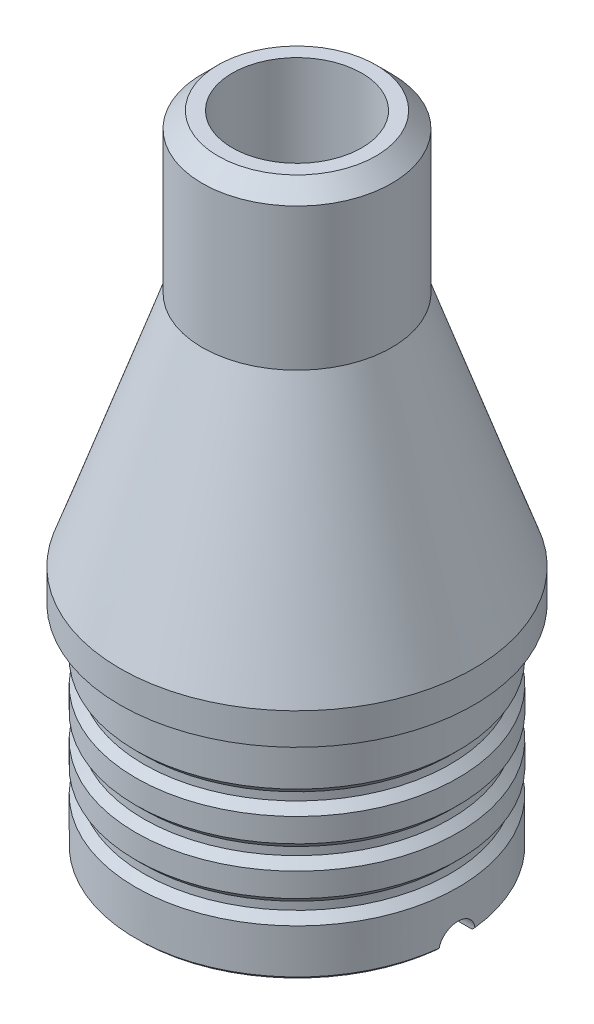
ISO-10303-21;
HEADER;
FILE_DESCRIPTION(('STEP AP214'),'2;1');
FILE_NAME('part.step','',(''),(''),'','','');
FILE_SCHEMA(('AUTOMOTIVE_DESIGN { 1 0 10303 214 1 1 1 1 }'));
ENDSEC;
DATA;
#1=APPLICATION_CONTEXT('core data for automotive mechanical design processes');
#2=APPLICATION_PROTOCOL_DEFINITION('international standard','automotive_design',2000,#1);
#3=PRODUCT_CONTEXT('',#1,'mechanical');
#4=PRODUCT('Part','Part','',(#3));
#5=PRODUCT_RELATED_PRODUCT_CATEGORY('part','',(#4));
#6=PRODUCT_DEFINITION_FORMATION('','',#4);
#7=PRODUCT_DEFINITION_CONTEXT('part definition',#1,'design');
#8=PRODUCT_DEFINITION('design','',#6,#7);
#9=PRODUCT_DEFINITION_SHAPE('','',#8);
#10=(LENGTH_UNIT() NAMED_UNIT(*) SI_UNIT(.MILLI.,.METRE.));
#11=(NAMED_UNIT(*) PLANE_ANGLE_UNIT() SI_UNIT($,.RADIAN.));
#12=(NAMED_UNIT(*) SI_UNIT($,.STERADIAN.) SOLID_ANGLE_UNIT());
#13=UNCERTAINTY_MEASURE_WITH_UNIT(LENGTH_MEASURE(1.E-05),#10,'distance_accuracy_value','');
#14=(GEOMETRIC_REPRESENTATION_CONTEXT(3) GLOBAL_UNCERTAINTY_ASSIGNED_CONTEXT((#13)) GLOBAL_UNIT_ASSIGNED_CONTEXT((#10,
#11,#12)) REPRESENTATION_CONTEXT('',''));
#15=CARTESIAN_POINT('',(0.,0.,0.));
#16=DIRECTION('',(0.,0.,1.));
#17=DIRECTION('',(1.,0.,0.));
#18=AXIS2_PLACEMENT_3D('',#15,#16,#17);
#19=CARTESIAN_POINT('',(0.,0.,0.));
#20=DIRECTION('',(0.,-1.,0.));
#21=DIRECTION('',(0.,0.,-1.));
#22=AXIS2_PLACEMENT_3D('',#19,#20,#21);
#23=CYLINDRICAL_SURFACE('',#22,10.2);
#24=CARTESIAN_POINT('',(-10.1349642327933,-5.5,1.15));
#25=CARTESIAN_POINT('',(-10.1349633502191,-5.46775524002687,1.14999990768807));
#26=CARTESIAN_POINT('',(-10.1351183107459,-5.43552602867082,1.14864298397679));
#27=CARTESIAN_POINT('',(-10.1357306130334,-5.37130024515533,1.14323046614495));
#28=CARTESIAN_POINT('',(-10.1361879331642,-5.33930365652024,1.13917506506559));
#29=CARTESIAN_POINT('',(-10.1379972709886,-5.24407609154166,1.12300336615497));
#30=CARTESIAN_POINT('',(-10.139786733819,-5.181486197438,1.10688144330646));
#31=CARTESIAN_POINT('',(-10.1443316050847,-5.05992511597337,1.06441844600939));
#32=CARTESIAN_POINT('',(-10.1470873542538,-5.00095521373134,1.0380737664428));
#33=CARTESIAN_POINT('',(-10.1532530389607,-4.88827027792611,0.975922259404736));
#34=CARTESIAN_POINT('',(-10.1566629090721,-4.83455471962326,0.940116378127089));
#35=CARTESIAN_POINT('',(-10.1637697244164,-4.73366928584066,0.859888503557032));
#36=CARTESIAN_POINT('',(-10.167467760398,-4.68652637217174,0.815432714696834));
#37=CARTESIAN_POINT('',(-10.1747248228774,-4.60034809349203,0.719233667168273));
#38=CARTESIAN_POINT('',(-10.1782838281338,-4.56131396346037,0.667489300450102));
#39=CARTESIAN_POINT('',(-10.1848725605143,-4.49237204834464,0.558015447795672));
#40=CARTESIAN_POINT('',(-10.1879008568018,-4.46248877763677,0.500270430744985));
#41=CARTESIAN_POINT('',(-10.1930746684833,-4.41285516540403,0.380545463588456));
#42=CARTESIAN_POINT('',(-10.1952202634919,-4.39310390998948,0.318565896003171));
#43=CARTESIAN_POINT('',(-10.1983793733878,-4.36437381898072,0.192407625739225));
#44=CARTESIAN_POINT('',(-10.1993976627615,-4.35534953926305,0.128239393542608));
#45=CARTESIAN_POINT('',(-10.2002037114243,-4.34818878553913,-0.000709889697529851));
#46=CARTESIAN_POINT('',(-10.1999914806608,-4.35005222351699,-0.0654909357828598));
#47=CARTESIAN_POINT('',(-10.1983642420948,-4.36457773958874,-0.193514620927063));
#48=CARTESIAN_POINT('',(-10.1969547119456,-4.37719063968913,-0.256762919099871));
#49=CARTESIAN_POINT('',(-10.1930974865104,-4.41278025297118,-0.380238921333598));
#50=CARTESIAN_POINT('',(-10.1906497800774,-4.43575707743215,-0.440466592953792));
#51=CARTESIAN_POINT('',(-10.1849818180886,-4.49147592850967,-0.5563468347658));
#52=CARTESIAN_POINT('',(-10.1817598472327,-4.52423967673852,-0.611988873160002));
#53=CARTESIAN_POINT('',(-10.1749045803068,-4.59858515491832,-0.71700073829481));
#54=CARTESIAN_POINT('',(-10.1712712867612,-4.64016683075151,-0.766370603526284));
#55=CARTESIAN_POINT('',(-10.1639770473594,-4.73123720275205,-0.857721543596263));
#56=CARTESIAN_POINT('',(-10.1603160585213,-4.7807676350635,-0.899661012877121));
#57=CARTESIAN_POINT('',(-10.1533975045894,-4.88620621344587,-0.974649868241155));
#58=CARTESIAN_POINT('',(-10.1501400609706,-4.94211627022756,-1.00769658092046));
#59=CARTESIAN_POINT('',(-10.144396900118,-5.05876888795778,-1.06396206412594));
#60=CARTESIAN_POINT('',(-10.1419118758195,-5.11951572696583,-1.08717201686574));
#61=CARTESIAN_POINT('',(-10.1380059945217,-5.2440341028807,-1.12301603244045));
#62=CARTESIAN_POINT('',(-10.1365835317193,-5.30780092008825,-1.13566605745126));
#63=CARTESIAN_POINT('',(-10.1355027722522,-5.39335012537774,-1.1452448578247));
#64=CARTESIAN_POINT('',(-10.1353009552745,-5.41465947201716,-1.14702890276953));
#65=CARTESIAN_POINT('',(-10.1350318472777,-5.45730956145658,-1.14940487104262));
#66=CARTESIAN_POINT('',(-10.1349643312788,-5.47865019171676,-1.14999878807522));
#67=CARTESIAN_POINT('',(-10.1349642327933,-5.5,-1.15));
#68=B_SPLINE_CURVE_WITH_KNOTS('',3,(#24,#25,#26,#27,#28,#29,#30,#31,#32,#33,#34,#35,#36,#37,#38,
#39,#40,#41,#42,#43,#44,#45,#46,#47,#48,#49,#50,#51,#52,#53,#54,#55,#56,#57,#58,#59,#60,#61,#62,
#63,#64,#65,#66,#67),.UNSPECIFIED.,.F.,.F.,(4,2,2,2,2,2,2,2,2,2,2,2,2,2,2,2,2,2,2,2,2,4),(0.,
0.0966745406116703,0.193342166152487,0.386318709058918,0.579363368270143,0.772388728814853,
0.966183966600919,1.16000869806968,1.35434821648226,1.54867020273374,1.74216598893861,
1.93566021093312,2.12827393397575,2.32088972519578,2.51393623517561,2.70698156041668,
2.90107582233508,3.09522836923152,3.2895545904991,3.4835865374904,3.54771677708946,
3.61173949548653),.UNSPECIFIED.);
#69=CARTESIAN_POINT('',(-10.1369374073238,-5.30000000000002,1.13247516529062));
#70=VERTEX_POINT('',#69);
#71=CARTESIAN_POINT('',(-10.1369374073238,-5.30000000000001,-1.13247516529065));
#72=VERTEX_POINT('',#71);
#73=EDGE_CURVE('E192',#70,#72,#68,.T.);
#74=ORIENTED_EDGE('',*,*,#73,.F.);
#75=CARTESIAN_POINT('',(0.,-5.30000000000002,0.));
#76=DIRECTION('',(0.,-1.,0.));
#77=DIRECTION('',(0.,0.,-1.));
#78=AXIS2_PLACEMENT_3D('',#75,#76,#77);
#79=CIRCLE('',#78,10.2);
#80=CARTESIAN_POINT('',(10.1369374073238,-5.30000000000001,1.13247516529065));
#81=VERTEX_POINT('',#80);
#82=EDGE_CURVE('E58',#70,#81,#79,.F.);
#83=ORIENTED_EDGE('',*,*,#82,.T.);
#84=CARTESIAN_POINT('',(10.1349642327933,-5.5,-1.15));
#85=CARTESIAN_POINT('',(10.1349633502191,-5.46775524002687,-1.14999990768807));
#86=CARTESIAN_POINT('',(10.1351183107459,-5.43552602867082,-1.14864298397679));
#87=CARTESIAN_POINT('',(10.1357306130334,-5.37130024515533,-1.14323046614495));
#88=CARTESIAN_POINT('',(10.1361879331642,-5.33930365652024,-1.13917506506559));
#89=CARTESIAN_POINT('',(10.1379972709886,-5.24407609154166,-1.12300336615497));
#90=CARTESIAN_POINT('',(10.139786733819,-5.181486197438,-1.10688144330646));
#91=CARTESIAN_POINT('',(10.1443316050847,-5.05992511597337,-1.06441844600939));
#92=CARTESIAN_POINT('',(10.1470873542538,-5.00095521373134,-1.0380737664428));
#93=CARTESIAN_POINT('',(10.1532530389607,-4.88827027792611,-0.975922259404736));
#94=CARTESIAN_POINT('',(10.1566629090721,-4.83455471962326,-0.940116378127089));
#95=CARTESIAN_POINT('',(10.1637697244164,-4.73366928584066,-0.859888503557032));
#96=CARTESIAN_POINT('',(10.167467760398,-4.68652637217174,-0.815432714696834));
#97=CARTESIAN_POINT('',(10.1747248228774,-4.60034809349203,-0.719233667168273));
#98=CARTESIAN_POINT('',(10.1782838281338,-4.56131396346037,-0.667489300450102));
#99=CARTESIAN_POINT('',(10.1848725605143,-4.49237204834464,-0.558015447795672));
#100=CARTESIAN_POINT('',(10.1879008568018,-4.46248877763677,-0.500270430744985));
#101=CARTESIAN_POINT('',(10.1930746684833,-4.41285516540403,-0.380545463588456));
#102=CARTESIAN_POINT('',(10.1952202634919,-4.39310390998948,-0.318565896003171));
#103=CARTESIAN_POINT('',(10.1983793733878,-4.36437381898072,-0.192407625739225));
#104=CARTESIAN_POINT('',(10.1993976627615,-4.35534953926305,-0.128239393542608));
#105=CARTESIAN_POINT('',(10.2002037114243,-4.34818878553913,0.000709889697529851));
#106=CARTESIAN_POINT('',(10.1999914806608,-4.35005222351699,0.0654909357828598));
#107=CARTESIAN_POINT('',(10.1983642420948,-4.36457773958874,0.193514620927063));
#108=CARTESIAN_POINT('',(10.1969547119456,-4.37719063968913,0.256762919099871));
#109=CARTESIAN_POINT('',(10.1930974865104,-4.41278025297118,0.380238921333598));
#110=CARTESIAN_POINT('',(10.1906497800774,-4.43575707743215,0.440466592953792));
#111=CARTESIAN_POINT('',(10.1849818180886,-4.49147592850967,0.5563468347658));
#112=CARTESIAN_POINT('',(10.1817598472327,-4.52423967673852,0.611988873160002));
#113=CARTESIAN_POINT('',(10.1749045803068,-4.59858515491832,0.71700073829481));
#114=CARTESIAN_POINT('',(10.1712712867612,-4.64016683075151,0.766370603526284));
#115=CARTESIAN_POINT('',(10.1639770473594,-4.73123720275205,0.857721543596263));
#116=CARTESIAN_POINT('',(10.1603160585213,-4.7807676350635,0.899661012877121));
#117=CARTESIAN_POINT('',(10.1533975045894,-4.88620621344587,0.974649868241155));
#118=CARTESIAN_POINT('',(10.1501400609706,-4.94211627022756,1.00769658092046));
#119=CARTESIAN_POINT('',(10.144396900118,-5.05876888795778,1.06396206412594));
#120=CARTESIAN_POINT('',(10.1419118758195,-5.11951572696583,1.08717201686574));
#121=CARTESIAN_POINT('',(10.1380059945217,-5.2440341028807,1.12301603244045));
#122=CARTESIAN_POINT('',(10.1365835317193,-5.30780092008825,1.13566605745126));
#123=CARTESIAN_POINT('',(10.1355027722522,-5.39335012537774,1.1452448578247));
#124=CARTESIAN_POINT('',(10.1353009552745,-5.41465947201716,1.14702890276953));
#125=CARTESIAN_POINT('',(10.1350318472777,-5.45730956145658,1.14940487104262));
#126=CARTESIAN_POINT('',(10.1349643312788,-5.47865019171676,1.14999878807522));
#127=CARTESIAN_POINT('',(10.1349642327933,-5.5,1.15));
#128=B_SPLINE_CURVE_WITH_KNOTS('',3,(#84,#85,#86,#87,#88,#89,#90,#91,#92,#93,#94,#95,#96,#97,
#98,#99,#100,#101,#102,#103,#104,#105,#106,#107,#108,#109,#110,#111,#112,#113,#114,#115,#116,
#117,#118,#119,#120,#121,#122,#123,#124,#125,#126,#127),.UNSPECIFIED.,.F.,.F.,(4,2,2,2,2,2,2,2,
2,2,2,2,2,2,2,2,2,2,2,2,2,4),(0.,0.0966745406116703,0.193342166152487,0.386318709058918,
0.579363368270143,0.772388728814853,0.966183966600919,1.16000869806968,1.35434821648226,
1.54867020273374,1.74216598893861,1.93566021093312,2.12827393397575,2.32088972519578,
2.51393623517561,2.70698156041668,2.90107582233508,3.09522836923152,3.2895545904991,
3.4835865374904,3.54771677708946,3.61173949548653),.UNSPECIFIED.);
#129=CARTESIAN_POINT('',(10.1369374073238,-5.30000000000002,-1.13247516529062));
#130=VERTEX_POINT('',#129);
#131=EDGE_CURVE('E124',#130,#81,#128,.T.);
#132=ORIENTED_EDGE('',*,*,#131,.F.);
#133=CARTESIAN_POINT('',(0.,-5.30000000000002,0.));
#134=DIRECTION('',(0.,-1.,0.));
#135=DIRECTION('',(0.,0.,-1.));
#136=AXIS2_PLACEMENT_3D('',#133,#134,#135);
#137=CIRCLE('',#136,10.2);
#138=EDGE_CURVE('E296',#130,#72,#137,.F.);
#139=ORIENTED_EDGE('',*,*,#138,.T.);
#140=EDGE_LOOP('',(#74,#83,#132,#139));
#141=FACE_BOUND('',#140,.T.);
#142=CARTESIAN_POINT('',(0.,-2.49999999999997,0.));
#143=DIRECTION('',(0.,1.,0.));
#144=DIRECTION('',(0.,0.,1.));
#145=AXIS2_PLACEMENT_3D('',#142,#143,#144);
#146=CIRCLE('',#145,10.2000000000001);
#147=CARTESIAN_POINT('',(0.,-2.49999999999997,10.2000000000001));
#148=VERTEX_POINT('',#147);
#149=EDGE_CURVE('E323',#148,#148,#146,.T.);
#150=ORIENTED_EDGE('',*,*,#149,.F.);
#151=EDGE_LOOP('',(#150));
#152=FACE_BOUND('',#151,.T.);
#153=ADVANCED_FACE('F35',(#141,#152),#23,.T.);
#154=CARTESIAN_POINT('',(0.,0.500000000000028,0.));
#155=DIRECTION('',(0.,1.,0.));
#156=DIRECTION('',(0.,0.,1.));
#157=AXIS2_PLACEMENT_3D('',#154,#155,#156);
#158=CIRCLE('',#157,10.2);
#159=CARTESIAN_POINT('',(0.,0.500000000000028,10.2));
#160=VERTEX_POINT('',#159);
#161=EDGE_CURVE('E311',#160,#160,#158,.T.);
#162=ORIENTED_EDGE('',*,*,#161,.F.);
#163=EDGE_LOOP('',(#162));
#164=FACE_BOUND('',#163,.T.);
#165=CARTESIAN_POINT('',(0.,-0.999999999999973,0.));
#166=DIRECTION('',(0.,1.,0.));
#167=DIRECTION('',(0.,0.,1.));
#168=AXIS2_PLACEMENT_3D('',#165,#166,#167);
#169=CIRCLE('',#168,10.2000000000001);
#170=CARTESIAN_POINT('',(0.,-0.999999999999973,10.2000000000001));
#171=VERTEX_POINT('',#170);
#172=EDGE_CURVE('E332',#171,#171,#169,.T.);
#173=ORIENTED_EDGE('',*,*,#172,.T.);
#174=EDGE_LOOP('',(#173));
#175=FACE_BOUND('',#174,.T.);
#176=ADVANCED_FACE('F264',(#164,#175),#23,.T.);
#177=CARTESIAN_POINT('',(0.,3.50000000000003,0.));
#178=DIRECTION('',(0.,1.,0.));
#179=DIRECTION('',(0.,0.,1.));
#180=AXIS2_PLACEMENT_3D('',#177,#178,#179);
#181=CIRCLE('',#180,10.2);
#182=CARTESIAN_POINT('',(0.,3.50000000000003,10.2));
#183=VERTEX_POINT('',#182);
#184=EDGE_CURVE('E112',#183,#183,#181,.T.);
#185=ORIENTED_EDGE('',*,*,#184,.F.);
#186=EDGE_LOOP('',(#185));
#187=FACE_BOUND('',#186,.T.);
#188=CARTESIAN_POINT('',(0.,2.00000000000003,0.));
#189=DIRECTION('',(0.,1.,0.));
#190=DIRECTION('',(0.,0.,1.));
#191=AXIS2_PLACEMENT_3D('',#188,#189,#190);
#192=CIRCLE('',#191,10.2);
#193=CARTESIAN_POINT('',(0.,2.00000000000003,10.2));
#194=VERTEX_POINT('',#193);
#195=EDGE_CURVE('E320',#194,#194,#192,.T.);
#196=ORIENTED_EDGE('',*,*,#195,.T.);
#197=EDGE_LOOP('',(#196));
#198=FACE_BOUND('',#197,.T.);
#199=ADVANCED_FACE('F290',(#187,#198),#23,.T.);
#200=CARTESIAN_POINT('',(0.,8.00000000000003,0.));
#201=DIRECTION('',(0.,-1.,0.));
#202=DIRECTION('',(0.,0.,-1.));
#203=AXIS2_PLACEMENT_3D('',#200,#201,#202);
#204=CIRCLE('',#203,10.2);
#205=CARTESIAN_POINT('',(0.,8.00000000000003,-10.2));
#206=VERTEX_POINT('',#205);
#207=EDGE_CURVE('E139',#206,#206,#204,.T.);
#208=ORIENTED_EDGE('',*,*,#207,.T.);
#209=EDGE_LOOP('',(#208));
#210=FACE_BOUND('',#209,.T.);
#211=CARTESIAN_POINT('',(0.,5.00000000000002,0.));
#212=DIRECTION('',(0.,1.,0.));
#213=DIRECTION('',(0.,0.,1.));
#214=AXIS2_PLACEMENT_3D('',#211,#212,#213);
#215=CIRCLE('',#214,10.2);
#216=CARTESIAN_POINT('',(0.,5.00000000000002,10.2));
#217=VERTEX_POINT('',#216);
#218=EDGE_CURVE('E308',#217,#217,#215,.T.);
#219=ORIENTED_EDGE('',*,*,#218,.T.);
#220=EDGE_LOOP('',(#219));
#221=FACE_BOUND('',#220,.T.);
#222=ADVANCED_FACE('F265',(#210,#221),#23,.T.);
#223=CARTESIAN_POINT('',(0.,-5.5,0.));
#224=DIRECTION('',(0.,-1.,0.));
#225=DIRECTION('',(0.,0.,-1.));
#226=AXIS2_PLACEMENT_3D('',#223,#224,#225);
#227=PLANE('',#226);
#228=DIRECTION('',(1.,0.,0.));
#229=VECTOR('',#228,1.);
#230=CARTESIAN_POINT('',(-11.2,-5.5,-1.15));
#231=LINE('',#230,#229);
#232=CARTESIAN_POINT('',(-9.93365491649475,-5.5,-1.15));
#233=VERTEX_POINT('',#232);
#234=CARTESIAN_POINT('',(-8.27042925125413,-5.5,-1.15));
#235=VERTEX_POINT('',#234);
#236=EDGE_CURVE('E96',#233,#235,#231,.T.);
#237=ORIENTED_EDGE('',*,*,#236,.F.);
#238=CARTESIAN_POINT('',(0.,-5.5,0.));
#239=DIRECTION('',(0.,-1.,0.));
#240=DIRECTION('',(0.,0.,-1.));
#241=AXIS2_PLACEMENT_3D('',#238,#239,#240);
#242=CIRCLE('',#241,10.);
#243=CARTESIAN_POINT('',(9.93365491649475,-5.5,-1.15));
#244=VERTEX_POINT('',#243);
#245=EDGE_CURVE('E11',#233,#244,#242,.T.);
#246=ORIENTED_EDGE('',*,*,#245,.T.);
#247=CARTESIAN_POINT('',(8.27042925125413,-5.5,-1.15));
#248=VERTEX_POINT('',#247);
#249=EDGE_CURVE('E294',#248,#244,#231,.T.);
#250=ORIENTED_EDGE('',*,*,#249,.F.);
#251=CARTESIAN_POINT('',(0.,-5.5,0.));
#252=DIRECTION('',(0.,-1.,0.));
#253=DIRECTION('',(0.,0.,-1.));
#254=AXIS2_PLACEMENT_3D('',#251,#252,#253);
#255=CIRCLE('',#254,8.35);
#256=EDGE_CURVE('E119',#235,#248,#255,.T.);
#257=ORIENTED_EDGE('',*,*,#256,.F.);
#258=EDGE_LOOP('',(#237,#246,#250,#257));
#259=FACE_BOUND('',#258,.T.);
#260=ADVANCED_FACE('F238',(#259),#227,.T.);
#261=CARTESIAN_POINT('',(0.,0.,-10.2));
#262=DIRECTION('',(0.,-1.,0.));
#263=DIRECTION('',(0.,0.,-1.));
#264=AXIS2_PLACEMENT_3D('',#261,#262,#263);
#265=PLANE('',#264);
#266=CARTESIAN_POINT('',(0.,0.,0.));
#267=DIRECTION('',(0.,-1.,0.));
#268=DIRECTION('',(0.,0.,-1.));
#269=AXIS2_PLACEMENT_3D('',#266,#267,#268);
#270=CIRCLE('',#269,4.6);
#271=CARTESIAN_POINT('',(0.,0.,-4.6));
#272=VERTEX_POINT('',#271);
#273=EDGE_CURVE('E102',#272,#272,#270,.F.);
#274=ORIENTED_EDGE('',*,*,#273,.T.);
#275=EDGE_LOOP('',(#274));
#276=FACE_BOUND('',#275,.T.);
#277=CARTESIAN_POINT('',(-6.3,0.,0.));
#278=DIRECTION('',(0.,1.,0.));
#279=DIRECTION('',(0.,0.,1.));
#280=AXIS2_PLACEMENT_3D('',#277,#278,#279);
#281=CIRCLE('',#280,1.6);
#282=CARTESIAN_POINT('',(-6.3,0.,1.6));
#283=VERTEX_POINT('',#282);
#284=EDGE_CURVE('E134',#283,#283,#281,.T.);
#285=ORIENTED_EDGE('',*,*,#284,.T.);
#286=EDGE_LOOP('',(#285));
#287=FACE_BOUND('',#286,.T.);
#288=CARTESIAN_POINT('',(6.3,0.,0.));
#289=DIRECTION('',(0.,1.,0.));
#290=DIRECTION('',(0.,0.,-1.));
#291=AXIS2_PLACEMENT_3D('',#288,#289,#290);
#292=CIRCLE('',#291,1.6);
#293=CARTESIAN_POINT('',(6.3,0.,-1.6));
#294=VERTEX_POINT('',#293);
#295=EDGE_CURVE('E118',#294,#294,#292,.T.);
#296=ORIENTED_EDGE('',*,*,#295,.T.);
#297=EDGE_LOOP('',(#296));
#298=FACE_BOUND('',#297,.T.);
#299=CARTESIAN_POINT('',(0.,0.,0.));
#300=DIRECTION('',(0.,-1.,0.));
#301=DIRECTION('',(0.,0.,-1.));
#302=AXIS2_PLACEMENT_3D('',#299,#300,#301);
#303=CIRCLE('',#302,8.35);
#304=CARTESIAN_POINT('',(0.,0.,-8.35));
#305=VERTEX_POINT('',#304);
#306=EDGE_CURVE('E162',#305,#305,#303,.F.);
#307=ORIENTED_EDGE('',*,*,#306,.F.);
#308=EDGE_LOOP('',(#307));
#309=FACE_BOUND('',#308,.T.);
#310=ADVANCED_FACE('F234',(#276,#287,#298,#309),#265,.T.);
#311=CARTESIAN_POINT('',(0.,0.,0.));
#312=DIRECTION('',(0.,-1.,0.));
#313=DIRECTION('',(0.,0.,-1.));
#314=AXIS2_PLACEMENT_3D('',#311,#312,#313);
#315=CYLINDRICAL_SURFACE('',#314,4.1);
#316=CARTESIAN_POINT('',(0.,0.499999999999994,0.));
#317=DIRECTION('',(0.,-1.,0.));
#318=DIRECTION('',(0.,0.,-1.));
#319=AXIS2_PLACEMENT_3D('',#316,#317,#318);
#320=CIRCLE('',#319,4.1);
#321=CARTESIAN_POINT('',(0.,0.499999999999994,-4.1));
#322=VERTEX_POINT('',#321);
#323=EDGE_CURVE('E165',#322,#322,#320,.T.);
#324=ORIENTED_EDGE('',*,*,#323,.T.);
#325=EDGE_LOOP('',(#324));
#326=FACE_BOUND('',#325,.T.);
#327=CARTESIAN_POINT('',(0.,35.,0.));
#328=DIRECTION('',(0.,-1.,0.));
#329=DIRECTION('',(0.,0.,-1.));
#330=AXIS2_PLACEMENT_3D('',#327,#328,#329);
#331=CIRCLE('',#330,4.1);
#332=CARTESIAN_POINT('',(0.,35.,-4.1));
#333=VERTEX_POINT('',#332);
#334=EDGE_CURVE('E153',#333,#333,#331,.T.);
#335=ORIENTED_EDGE('',*,*,#334,.F.);
#336=EDGE_LOOP('',(#335));
#337=FACE_BOUND('',#336,.T.);
#338=ADVANCED_FACE('F237',(#326,#337),#315,.F.);
#339=CARTESIAN_POINT('',(0.,35.,-4.1));
#340=DIRECTION('',(0.,1.,0.));
#341=DIRECTION('',(0.,0.,1.));
#342=AXIS2_PLACEMENT_3D('',#339,#340,#341);
#343=PLANE('',#342);
#344=CARTESIAN_POINT('',(0.,35.,0.));
#345=DIRECTION('',(0.,1.,0.));
#346=DIRECTION('',(0.,0.,1.));
#347=AXIS2_PLACEMENT_3D('',#344,#345,#346);
#348=CIRCLE('',#347,4.99999999999998);
#349=CARTESIAN_POINT('',(0.,35.,4.99999999999998));
#350=VERTEX_POINT('',#349);
#351=EDGE_CURVE('E159',#350,#350,#348,.T.);
#352=ORIENTED_EDGE('',*,*,#351,.T.);
#353=EDGE_LOOP('',(#352));
#354=FACE_BOUND('',#353,.T.);
#355=ORIENTED_EDGE('',*,*,#334,.T.);
#356=EDGE_LOOP('',(#355));
#357=FACE_BOUND('',#356,.T.);
#358=ADVANCED_FACE('F242',(#354,#357),#343,.T.);
#359=CARTESIAN_POINT('',(0.,0.,0.));
#360=DIRECTION('',(0.,-1.,0.));
#361=DIRECTION('',(0.,0.,-1.));
#362=AXIS2_PLACEMENT_3D('',#359,#360,#361);
#363=CYLINDRICAL_SURFACE('',#362,6.);
#364=CARTESIAN_POINT('',(0.,34.,0.));
#365=DIRECTION('',(0.,1.,0.));
#366=DIRECTION('',(0.,0.,1.));
#367=AXIS2_PLACEMENT_3D('',#364,#365,#366);
#368=CIRCLE('',#367,6.);
#369=CARTESIAN_POINT('',(0.,34.,6.));
#370=VERTEX_POINT('',#369);
#371=EDGE_CURVE('E156',#370,#370,#368,.F.);
#372=ORIENTED_EDGE('',*,*,#371,.T.);
#373=EDGE_LOOP('',(#372));
#374=FACE_BOUND('',#373,.T.);
#375=CARTESIAN_POINT('',(0.,25.,0.));
#376=DIRECTION('',(0.,-1.,0.));
#377=DIRECTION('',(0.,0.,-1.));
#378=AXIS2_PLACEMENT_3D('',#375,#376,#377);
#379=CIRCLE('',#378,6.);
#380=CARTESIAN_POINT('',(0.,25.,-6.));
#381=VERTEX_POINT('',#380);
#382=EDGE_CURVE('E150',#381,#381,#379,.T.);
#383=ORIENTED_EDGE('',*,*,#382,.F.);
#384=EDGE_LOOP('',(#383));
#385=FACE_BOUND('',#384,.T.);
#386=ADVANCED_FACE('F246',(#374,#385),#363,.T.);
#387=CARTESIAN_POINT('',(0.,10.,0.));
#388=DIRECTION('',(0.,-1.,0.));
#389=DIRECTION('',(0.,0.,-1.));
#390=AXIS2_PLACEMENT_3D('',#387,#388,#389);
#391=CONICAL_SURFACE('',#390,11.2,0.33370217653755);
#392=ORIENTED_EDGE('',*,*,#382,.T.);
#393=EDGE_LOOP('',(#392));
#394=FACE_BOUND('',#393,.T.);
#395=CARTESIAN_POINT('',(0.,10.,0.));
#396=DIRECTION('',(0.,-1.,0.));
#397=DIRECTION('',(0.,0.,-1.));
#398=AXIS2_PLACEMENT_3D('',#395,#396,#397);
#399=CIRCLE('',#398,11.2);
#400=CARTESIAN_POINT('',(0.,10.,-11.2));
#401=VERTEX_POINT('',#400);
#402=EDGE_CURVE('E147',#401,#401,#399,.T.);
#403=ORIENTED_EDGE('',*,*,#402,.F.);
#404=EDGE_LOOP('',(#403));
#405=FACE_BOUND('',#404,.T.);
#406=ADVANCED_FACE('F250',(#394,#405),#391,.T.);
#407=CARTESIAN_POINT('',(0.,0.,0.));
#408=DIRECTION('',(0.,-1.,0.));
#409=DIRECTION('',(0.,0.,-1.));
#410=AXIS2_PLACEMENT_3D('',#407,#408,#409);
#411=CYLINDRICAL_SURFACE('',#410,11.2);
#412=ORIENTED_EDGE('',*,*,#402,.T.);
#413=EDGE_LOOP('',(#412));
#414=FACE_BOUND('',#413,.T.);
#415=CARTESIAN_POINT('',(0.,8.00000000000002,0.));
#416=DIRECTION('',(0.,-1.,0.));
#417=DIRECTION('',(0.,0.,-1.));
#418=AXIS2_PLACEMENT_3D('',#415,#416,#417);
#419=CIRCLE('',#418,11.2);
#420=CARTESIAN_POINT('',(0.,8.00000000000002,-11.2));
#421=VERTEX_POINT('',#420);
#422=EDGE_CURVE('E144',#421,#421,#419,.T.);
#423=ORIENTED_EDGE('',*,*,#422,.F.);
#424=EDGE_LOOP('',(#423));
#425=FACE_BOUND('',#424,.T.);
#426=ADVANCED_FACE('F254',(#414,#425),#411,.T.);
#427=CARTESIAN_POINT('',(0.,8.00000000000002,-11.2));
#428=DIRECTION('',(0.,-1.,0.));
#429=DIRECTION('',(0.,0.,-1.));
#430=AXIS2_PLACEMENT_3D('',#427,#428,#429);
#431=PLANE('',#430);
#432=ORIENTED_EDGE('',*,*,#422,.T.);
#433=EDGE_LOOP('',(#432));
#434=FACE_BOUND('',#433,.T.);
#435=ORIENTED_EDGE('',*,*,#207,.F.);
#436=EDGE_LOOP('',(#435));
#437=FACE_BOUND('',#436,.T.);
#438=ADVANCED_FACE('F232',(#434,#437),#431,.T.);
#439=CARTESIAN_POINT('',(0.,34.,0.));
#440=DIRECTION('',(0.,-1.,0.));
#441=DIRECTION('',(0.,0.,-1.));
#442=AXIS2_PLACEMENT_3D('',#439,#440,#441);
#443=CONICAL_SURFACE('',#442,6.,0.785398163397454);
#444=ORIENTED_EDGE('',*,*,#351,.F.);
#445=EDGE_LOOP('',(#444));
#446=FACE_BOUND('',#445,.T.);
#447=ORIENTED_EDGE('',*,*,#371,.F.);
#448=EDGE_LOOP('',(#447));
#449=FACE_BOUND('',#448,.T.);
#450=ADVANCED_FACE('F228',(#446,#449),#443,.T.);
#451=CARTESIAN_POINT('',(-6.3,3.2,0.));
#452=DIRECTION('',(0.,-1.,0.));
#453=DIRECTION('',(0.,0.,-1.));
#454=AXIS2_PLACEMENT_3D('',#451,#452,#453);
#455=CYLINDRICAL_SURFACE('',#454,1.6);
#456=CARTESIAN_POINT('',(-6.3,3.2,0.));
#457=DIRECTION('',(0.,1.,0.));
#458=DIRECTION('',(0.,0.,1.));
#459=AXIS2_PLACEMENT_3D('',#456,#457,#458);
#460=CIRCLE('',#459,1.6);
#461=CARTESIAN_POINT('',(-6.3,3.2,1.6));
#462=VERTEX_POINT('',#461);
#463=EDGE_CURVE('E136',#462,#462,#460,.T.);
#464=ORIENTED_EDGE('',*,*,#463,.T.);
#465=EDGE_LOOP('',(#464));
#466=FACE_BOUND('',#465,.T.);
#467=ORIENTED_EDGE('',*,*,#284,.F.);
#468=EDGE_LOOP('',(#467));
#469=FACE_BOUND('',#468,.T.);
#470=ADVANCED_FACE('F231',(#466,#469),#455,.F.);
#471=CARTESIAN_POINT('',(-6.3,3.2,0.));
#472=DIRECTION('',(0.,1.,0.));
#473=DIRECTION('',(0.,0.,1.));
#474=AXIS2_PLACEMENT_3D('',#471,#472,#473);
#475=PLANE('',#474);
#476=ORIENTED_EDGE('',*,*,#463,.F.);
#477=EDGE_LOOP('',(#476));
#478=FACE_BOUND('',#477,.T.);
#479=ADVANCED_FACE('F269',(#478),#475,.F.);
#480=CARTESIAN_POINT('',(6.3,3.2,0.));
#481=DIRECTION('',(0.,-1.,0.));
#482=DIRECTION('',(0.,0.,-1.));
#483=AXIS2_PLACEMENT_3D('',#480,#481,#482);
#484=CYLINDRICAL_SURFACE('',#483,1.6);
#485=CARTESIAN_POINT('',(6.3,3.2,0.));
#486=DIRECTION('',(0.,1.,0.));
#487=DIRECTION('',(0.,0.,-1.));
#488=AXIS2_PLACEMENT_3D('',#485,#486,#487);
#489=CIRCLE('',#488,1.6);
#490=CARTESIAN_POINT('',(6.3,3.2,-1.6));
#491=VERTEX_POINT('',#490);
#492=EDGE_CURVE('E122',#491,#491,#489,.T.);
#493=ORIENTED_EDGE('',*,*,#492,.T.);
#494=EDGE_LOOP('',(#493));
#495=FACE_BOUND('',#494,.T.);
#496=ORIENTED_EDGE('',*,*,#295,.F.);
#497=EDGE_LOOP('',(#496));
#498=FACE_BOUND('',#497,.T.);
#499=ADVANCED_FACE('F273',(#495,#498),#484,.F.);
#500=CARTESIAN_POINT('',(6.3,3.2,0.));
#501=DIRECTION('',(0.,-1.,0.));
#502=DIRECTION('',(0.,0.,-1.));
#503=AXIS2_PLACEMENT_3D('',#500,#501,#502);
#504=PLANE('',#503);
#505=ORIENTED_EDGE('',*,*,#492,.F.);
#506=EDGE_LOOP('',(#505));
#507=FACE_BOUND('',#506,.T.);
#508=ADVANCED_FACE('F277',(#507),#504,.T.);
#509=DIRECTION('',(1.,0.,0.));
#510=VECTOR('',#509,1.);
#511=CARTESIAN_POINT('',(-11.2,-5.5,1.15));
#512=LINE('',#511,#510);
#513=CARTESIAN_POINT('',(9.93365491649475,-5.5,1.15));
#514=VERTEX_POINT('',#513);
#515=CARTESIAN_POINT('',(8.27042925125413,-5.5,1.15));
#516=VERTEX_POINT('',#515);
#517=EDGE_CURVE('E114',#514,#516,#512,.F.);
#518=ORIENTED_EDGE('',*,*,#517,.F.);
#519=CARTESIAN_POINT('',(0.,-5.5,0.));
#520=DIRECTION('',(0.,-1.,0.));
#521=DIRECTION('',(0.,0.,-1.));
#522=AXIS2_PLACEMENT_3D('',#519,#520,#521);
#523=CIRCLE('',#522,10.);
#524=CARTESIAN_POINT('',(-9.93365491649475,-5.5,1.15));
#525=VERTEX_POINT('',#524);
#526=EDGE_CURVE('E111',#514,#525,#523,.T.);
#527=ORIENTED_EDGE('',*,*,#526,.T.);
#528=CARTESIAN_POINT('',(-8.27042925125413,-5.5,1.15));
#529=VERTEX_POINT('',#528);
#530=EDGE_CURVE('E94',#529,#525,#512,.F.);
#531=ORIENTED_EDGE('',*,*,#530,.F.);
#532=EDGE_CURVE('E109',#516,#529,#255,.T.);
#533=ORIENTED_EDGE('',*,*,#532,.F.);
#534=EDGE_LOOP('',(#518,#527,#531,#533));
#535=FACE_BOUND('',#534,.T.);
#536=ADVANCED_FACE('F108',(#535),#227,.T.);
#537=CARTESIAN_POINT('',(0.,-5.5,0.));
#538=DIRECTION('',(0.,1.,0.));
#539=DIRECTION('',(0.,0.,1.));
#540=AXIS2_PLACEMENT_3D('',#537,#538,#539);
#541=CYLINDRICAL_SURFACE('',#540,8.35);
#542=CARTESIAN_POINT('',(8.27042925125413,-5.5,1.15));
#543=CARTESIAN_POINT('',(8.27042816093504,-5.4678092146705,1.14999996799576));
#544=CARTESIAN_POINT('',(8.27061743383609,-5.43563400246833,1.14864752174861));
#545=CARTESIAN_POINT('',(8.27136524055401,-5.37151684004145,1.14325326194504));
#546=CARTESIAN_POINT('',(8.2719237436034,-5.33957487060513,1.13921167247136));
#547=CARTESIAN_POINT('',(8.27413302766024,-5.24451967289335,1.12309736184902));
#548=CARTESIAN_POINT('',(8.27631767283826,-5.18204795933781,1.10703495567511));
#549=CARTESIAN_POINT('',(8.28186451977567,-5.06072187008266,1.06473908247307));
#550=CARTESIAN_POINT('',(8.28522707206297,-5.00186857730727,1.03850258753629));
#551=CARTESIAN_POINT('',(8.29274929001921,-4.8893932833583,0.976615210167525));
#552=CARTESIAN_POINT('',(8.29690891352325,-4.83577100569134,0.940964825690855));
#553=CARTESIAN_POINT('',(8.30558752435062,-4.73493261986865,0.861009655104729));
#554=CARTESIAN_POINT('',(8.3101085017041,-4.68775650579086,0.816654661946685));
#555=CARTESIAN_POINT('',(8.31898312066479,-4.60148688191421,0.720652013222889));
#556=CARTESIAN_POINT('',(8.32333673665617,-4.5623946054246,0.669003246903793));
#557=CARTESIAN_POINT('',(8.3314064569827,-4.49326208637055,0.55962573074805));
#558=CARTESIAN_POINT('',(8.33511993369578,-4.46325878769617,0.50187342063685));
#559=CARTESIAN_POINT('',(8.34146853379323,-4.41339411115443,0.382093257563448));
#560=CARTESIAN_POINT('',(8.34410376852081,-4.39353168605088,0.32006584683707));
#561=CARTESIAN_POINT('',(8.34798506397677,-4.36463210758498,0.193909437114747));
#562=CARTESIAN_POINT('',(8.3492398066386,-4.35552727249799,0.129796213881342));
#563=CARTESIAN_POINT('',(8.35024845875372,-4.34819131488819,0.000938915673235542));
#564=CARTESIAN_POINT('',(8.35000240300236,-4.34995994026898,-0.0638051446410376));
#565=CARTESIAN_POINT('',(8.34804410779455,-4.36426725852567,-0.191621728196732));
#566=CARTESIAN_POINT('',(8.34634182032105,-4.37673284943503,-0.254702608249828));
#567=CARTESIAN_POINT('',(8.34167346595095,-4.41196567985756,-0.377868182774357));
#568=CARTESIAN_POINT('',(8.33870737798964,-4.43473309107932,-0.437952827286627));
#569=CARTESIAN_POINT('',(8.3318274825937,-4.4900000530683,-0.553645640711214));
#570=CARTESIAN_POINT('',(8.32791062551352,-4.52253100196017,-0.609238621786184));
#571=CARTESIAN_POINT('',(8.31956682417652,-4.59637744385732,-0.714201805581773));
#572=CARTESIAN_POINT('',(8.31513987238395,-4.63769306664818,-0.763571916347965));
#573=CARTESIAN_POINT('',(8.30622753846958,-4.72833794058268,-0.855114466917614));
#574=CARTESIAN_POINT('',(8.3017419744561,-4.77772989998499,-0.897224812143278));
#575=CARTESIAN_POINT('',(8.29325210684044,-4.88293125012929,-0.972580376858686));
#576=CARTESIAN_POINT('',(8.28924794468226,-4.93874251759336,-1.00582299434008));
#577=CARTESIAN_POINT('',(8.28217382466946,-5.05526570254607,-1.06250496593497));
#578=CARTESIAN_POINT('',(8.27910496042661,-5.11598325268002,-1.08593285591744));
#579=CARTESIAN_POINT('',(8.27426674127444,-5.24049931775422,-1.12220784396983));
#580=CARTESIAN_POINT('',(8.27249543440376,-5.30429305034517,-1.13507083873312));
#581=CARTESIAN_POINT('',(8.27112545761674,-5.39046093600746,-1.14498317157558));
#582=CARTESIAN_POINT('',(8.27086457833267,-5.41234505956283,-1.1468653475845));
#583=CARTESIAN_POINT('',(8.27051667097075,-5.4561496709283,-1.14937209010363));
#584=CARTESIAN_POINT('',(8.27042935103587,-5.47807003554802,-1.14999876787118));
#585=CARTESIAN_POINT('',(8.27042925125413,-5.5,-1.15));
#586=B_SPLINE_CURVE_WITH_KNOTS('',3,(#542,#543,#544,#545,#546,#547,#548,#549,#550,#551,#552,
#553,#554,#555,#556,#557,#558,#559,#560,#561,#562,#563,#564,#565,#566,#567,#568,#569,#570,#571,
#572,#573,#574,#575,#576,#577,#578,#579,#580,#581,#582,#583,#584,#585),.UNSPECIFIED.,.F.,.F.,(4,
2,2,2,2,2,2,2,2,2,2,2,2,2,2,2,2,2,2,2,2,4),(0.,0.0965125543613318,0.193017067466558,
0.385643476270952,0.578327256636287,0.771000846877973,0.964820270762998,1.15866924289348,
1.35329589353245,1.54790244123673,1.7412779830902,1.93464904163341,2.12670905142138,
2.31877226254353,2.51145986250348,2.70415030944566,2.89841489784556,3.09273642568587,
3.28728430293194,3.48153891053024,3.54741136753854,3.61317295952816),.UNSPECIFIED.);
#587=EDGE_CURVE('E101',#516,#248,#586,.T.);
#588=ORIENTED_EDGE('',*,*,#587,.F.);
#589=ORIENTED_EDGE('',*,*,#532,.T.);
#590=CARTESIAN_POINT('',(-8.27042925125413,-5.5,-1.15));
#591=CARTESIAN_POINT('',(-8.27042816093504,-5.4678092146705,-1.14999996799576));
#592=CARTESIAN_POINT('',(-8.27061743383609,-5.43563400246833,-1.14864752174861));
#593=CARTESIAN_POINT('',(-8.27136524055401,-5.37151684004145,-1.14325326194504));
#594=CARTESIAN_POINT('',(-8.2719237436034,-5.33957487060513,-1.13921167247136));
#595=CARTESIAN_POINT('',(-8.27413302766024,-5.24451967289335,-1.12309736184902));
#596=CARTESIAN_POINT('',(-8.27631767283826,-5.18204795933781,-1.10703495567511));
#597=CARTESIAN_POINT('',(-8.28186451977567,-5.06072187008266,-1.06473908247307));
#598=CARTESIAN_POINT('',(-8.28522707206297,-5.00186857730727,-1.03850258753629));
#599=CARTESIAN_POINT('',(-8.29274929001921,-4.8893932833583,-0.976615210167525));
#600=CARTESIAN_POINT('',(-8.29690891352325,-4.83577100569134,-0.940964825690855));
#601=CARTESIAN_POINT('',(-8.30558752435062,-4.73493261986865,-0.861009655104729));
#602=CARTESIAN_POINT('',(-8.3101085017041,-4.68775650579086,-0.816654661946685));
#603=CARTESIAN_POINT('',(-8.31898312066479,-4.60148688191421,-0.720652013222889));
#604=CARTESIAN_POINT('',(-8.32333673665617,-4.5623946054246,-0.669003246903793));
#605=CARTESIAN_POINT('',(-8.3314064569827,-4.49326208637055,-0.55962573074805));
#606=CARTESIAN_POINT('',(-8.33511993369578,-4.46325878769617,-0.50187342063685));
#607=CARTESIAN_POINT('',(-8.34146853379323,-4.41339411115443,-0.382093257563448));
#608=CARTESIAN_POINT('',(-8.34410376852081,-4.39353168605088,-0.32006584683707));
#609=CARTESIAN_POINT('',(-8.34798506397677,-4.36463210758498,-0.193909437114747));
#610=CARTESIAN_POINT('',(-8.3492398066386,-4.35552727249799,-0.129796213881342));
#611=CARTESIAN_POINT('',(-8.35024845875372,-4.34819131488819,-0.000938915673235542));
#612=CARTESIAN_POINT('',(-8.35000240300236,-4.34995994026898,0.0638051446410376));
#613=CARTESIAN_POINT('',(-8.34804410779455,-4.36426725852567,0.191621728196732));
#614=CARTESIAN_POINT('',(-8.34634182032105,-4.37673284943503,0.254702608249828));
#615=CARTESIAN_POINT('',(-8.34167346595095,-4.41196567985756,0.377868182774357));
#616=CARTESIAN_POINT('',(-8.33870737798964,-4.43473309107932,0.437952827286627));
#617=CARTESIAN_POINT('',(-8.3318274825937,-4.4900000530683,0.553645640711214));
#618=CARTESIAN_POINT('',(-8.32791062551352,-4.52253100196017,0.609238621786184));
#619=CARTESIAN_POINT('',(-8.31956682417652,-4.59637744385732,0.714201805581773));
#620=CARTESIAN_POINT('',(-8.31513987238395,-4.63769306664818,0.763571916347965));
#621=CARTESIAN_POINT('',(-8.30622753846958,-4.72833794058268,0.855114466917614));
#622=CARTESIAN_POINT('',(-8.3017419744561,-4.77772989998499,0.897224812143278));
#623=CARTESIAN_POINT('',(-8.29325210684044,-4.88293125012929,0.972580376858686));
#624=CARTESIAN_POINT('',(-8.28924794468226,-4.93874251759336,1.00582299434008));
#625=CARTESIAN_POINT('',(-8.28217382466946,-5.05526570254607,1.06250496593497));
#626=CARTESIAN_POINT('',(-8.27910496042661,-5.11598325268002,1.08593285591744));
#627=CARTESIAN_POINT('',(-8.27426674127444,-5.24049931775422,1.12220784396983));
#628=CARTESIAN_POINT('',(-8.27249543440376,-5.30429305034517,1.13507083873312));
#629=CARTESIAN_POINT('',(-8.27112545761674,-5.39046093600746,1.14498317157558));
#630=CARTESIAN_POINT('',(-8.27086457833267,-5.41234505956283,1.1468653475845));
#631=CARTESIAN_POINT('',(-8.27051667097075,-5.4561496709283,1.14937209010363));
#632=CARTESIAN_POINT('',(-8.27042935103587,-5.47807003554802,1.14999876787118));
#633=CARTESIAN_POINT('',(-8.27042925125413,-5.5,1.15));
#634=B_SPLINE_CURVE_WITH_KNOTS('',3,(#590,#591,#592,#593,#594,#595,#596,#597,#598,#599,#600,
#601,#602,#603,#604,#605,#606,#607,#608,#609,#610,#611,#612,#613,#614,#615,#616,#617,#618,#619,
#620,#621,#622,#623,#624,#625,#626,#627,#628,#629,#630,#631,#632,#633),.UNSPECIFIED.,.F.,.F.,(4,
2,2,2,2,2,2,2,2,2,2,2,2,2,2,2,2,2,2,2,2,4),(0.,0.0965125543613318,0.193017067466558,
0.385643476270952,0.578327256636287,0.771000846877973,0.964820270762998,1.15866924289348,
1.35329589353245,1.54790244123673,1.7412779830902,1.93464904163341,2.12670905142138,
2.31877226254353,2.51145986250348,2.70415030944566,2.89841489784556,3.09273642568587,
3.28728430293194,3.48153891053024,3.54741136753854,3.61317295952816),.UNSPECIFIED.);
#635=EDGE_CURVE('E91',#235,#529,#634,.T.);
#636=ORIENTED_EDGE('',*,*,#635,.F.);
#637=ORIENTED_EDGE('',*,*,#256,.T.);
#638=EDGE_LOOP('',(#588,#589,#636,#637));
#639=FACE_BOUND('',#638,.T.);
#640=ORIENTED_EDGE('',*,*,#306,.T.);
#641=EDGE_LOOP('',(#640));
#642=FACE_BOUND('',#641,.T.);
#643=ADVANCED_FACE('F116',(#639,#642),#541,.F.);
#644=CARTESIAN_POINT('',(0.,0.499999999999994,0.));
#645=DIRECTION('',(0.,-1.,0.));
#646=DIRECTION('',(0.,0.,-1.));
#647=AXIS2_PLACEMENT_3D('',#644,#645,#646);
#648=CONICAL_SURFACE('',#647,4.1,0.785398163397455);
#649=ORIENTED_EDGE('',*,*,#273,.F.);
#650=EDGE_LOOP('',(#649));
#651=FACE_BOUND('',#650,.T.);
#652=ORIENTED_EDGE('',*,*,#323,.F.);
#653=EDGE_LOOP('',(#652));
#654=FACE_BOUND('',#653,.T.);
#655=ADVANCED_FACE('F184',(#651,#654),#648,.F.);
#656=CARTESIAN_POINT('',(-11.2,-5.5,0.));
#657=DIRECTION('',(1.,0.,0.));
#658=DIRECTION('',(0.,0.,-1.));
#659=AXIS2_PLACEMENT_3D('',#656,#657,#658);
#660=CYLINDRICAL_SURFACE('',#659,1.15);
#661=ORIENTED_EDGE('',*,*,#530,.T.);
#662=CARTESIAN_POINT('',(-9.93365491649475,-5.5,1.15));
#663=CARTESIAN_POINT('',(-9.96750495475128,-5.46638058274525,1.14999172950216));
#664=CARTESIAN_POINT('',(-10.0013701814444,-5.4329042074553,1.14852719136152));
#665=CARTESIAN_POINT('',(-10.0691310117208,-5.3662375407885,1.14268557979317));
#666=CARTESIAN_POINT('',(-10.1030266153039,-5.33304724941179,1.13830850636402));
#667=CARTESIAN_POINT('',(-10.1369374073238,-5.30000000000002,1.13247516529062));
#668=B_SPLINE_CURVE_WITH_KNOTS('',3,(#662,#663,#664,#665,#666,#667),.UNSPECIFIED.,.F.,.F.,(4,2,
4),(0.,0.142923040065202,0.28584608020112),.UNSPECIFIED.);
#669=EDGE_CURVE('E205',#525,#70,#668,.T.);
#670=ORIENTED_EDGE('',*,*,#669,.T.);
#671=ORIENTED_EDGE('',*,*,#73,.T.);
#672=CARTESIAN_POINT('',(-10.1369374073238,-5.30000000000002,-1.13247516529062));
#673=CARTESIAN_POINT('',(-10.1030266153039,-5.33304724941179,-1.13830850636402));
#674=CARTESIAN_POINT('',(-10.0691310117208,-5.3662375407885,-1.14268557979317));
#675=CARTESIAN_POINT('',(-10.0013701814444,-5.4329042074553,-1.14852719136152));
#676=CARTESIAN_POINT('',(-9.96750495475128,-5.46638058274525,-1.14999172950216));
#677=CARTESIAN_POINT('',(-9.93365491649475,-5.5,-1.15));
#678=B_SPLINE_CURVE_WITH_KNOTS('',3,(#672,#673,#674,#675,#676,#677),.UNSPECIFIED.,.F.,.F.,(4,2,
4),(0.,0.142923040135917,0.285846080201119),.UNSPECIFIED.);
#679=EDGE_CURVE('E200',#72,#233,#678,.T.);
#680=ORIENTED_EDGE('',*,*,#679,.T.);
#681=ORIENTED_EDGE('',*,*,#236,.T.);
#682=ORIENTED_EDGE('',*,*,#635,.T.);
#683=EDGE_LOOP('',(#661,#670,#671,#680,#681,#682));
#684=FACE_BOUND('',#683,.T.);
#685=ADVANCED_FACE('F93',(#684),#660,.F.);
#686=ORIENTED_EDGE('',*,*,#131,.T.);
#687=CARTESIAN_POINT('',(10.1369374073238,-5.30000000000002,1.13247516529062));
#688=CARTESIAN_POINT('',(10.1030266153039,-5.33304724941179,1.13830850636402));
#689=CARTESIAN_POINT('',(10.0691310117208,-5.3662375407885,1.14268557979317));
#690=CARTESIAN_POINT('',(10.0013701814444,-5.4329042074553,1.14852719136152));
#691=CARTESIAN_POINT('',(9.96750495475128,-5.46638058274525,1.14999172950216));
#692=CARTESIAN_POINT('',(9.93365491649475,-5.5,1.15));
#693=B_SPLINE_CURVE_WITH_KNOTS('',3,(#687,#688,#689,#690,#691,#692),.UNSPECIFIED.,.F.,.F.,(4,2,
4),(0.,0.142923040135917,0.285846080201119),.UNSPECIFIED.);
#694=EDGE_CURVE('E44',#81,#514,#693,.T.);
#695=ORIENTED_EDGE('',*,*,#694,.T.);
#696=ORIENTED_EDGE('',*,*,#517,.T.);
#697=ORIENTED_EDGE('',*,*,#587,.T.);
#698=ORIENTED_EDGE('',*,*,#249,.T.);
#699=CARTESIAN_POINT('',(9.93365491649475,-5.5,-1.15));
#700=CARTESIAN_POINT('',(9.96750495475128,-5.46638058274525,-1.14999172950216));
#701=CARTESIAN_POINT('',(10.0013701814444,-5.4329042074553,-1.14852719136152));
#702=CARTESIAN_POINT('',(10.0691310117208,-5.3662375407885,-1.14268557979317));
#703=CARTESIAN_POINT('',(10.1030266153039,-5.33304724941179,-1.13830850636402));
#704=CARTESIAN_POINT('',(10.1369374073238,-5.30000000000002,-1.13247516529062));
#705=B_SPLINE_CURVE_WITH_KNOTS('',3,(#699,#700,#701,#702,#703,#704),.UNSPECIFIED.,.F.,.F.,(4,2,
4),(0.,0.142923040065202,0.28584608020112),.UNSPECIFIED.);
#706=EDGE_CURVE('E51',#244,#130,#705,.T.);
#707=ORIENTED_EDGE('',*,*,#706,.T.);
#708=EDGE_LOOP('',(#686,#695,#696,#697,#698,#707));
#709=FACE_BOUND('',#708,.T.);
#710=ADVANCED_FACE('F183',(#709),#660,.F.);
#711=CARTESIAN_POINT('',(0.,4.00000000000003,0.));
#712=DIRECTION('',(0.,-1.,0.));
#713=DIRECTION('',(0.,0.,-1.));
#714=AXIS2_PLACEMENT_3D('',#711,#712,#713);
#715=CONICAL_SURFACE('',#714,9.7,0.785398163397452);
#716=ORIENTED_EDGE('',*,*,#184,.T.);
#717=EDGE_LOOP('',(#716));
#718=FACE_BOUND('',#717,.T.);
#719=CARTESIAN_POINT('',(0.,4.00000000000003,0.));
#720=DIRECTION('',(0.,1.,0.));
#721=DIRECTION('',(0.,0.,1.));
#722=AXIS2_PLACEMENT_3D('',#719,#720,#721);
#723=CIRCLE('',#722,9.7);
#724=CARTESIAN_POINT('',(0.,4.00000000000003,9.7));
#725=VERTEX_POINT('',#724);
#726=EDGE_CURVE('E302',#725,#725,#723,.T.);
#727=ORIENTED_EDGE('',*,*,#726,.F.);
#728=EDGE_LOOP('',(#727));
#729=FACE_BOUND('',#728,.T.);
#730=ADVANCED_FACE('F185',(#718,#729),#715,.T.);
#731=CARTESIAN_POINT('',(0.,35.,0.));
#732=DIRECTION('',(0.,1.,0.));
#733=DIRECTION('',(0.,0.,1.));
#734=AXIS2_PLACEMENT_3D('',#731,#732,#733);
#735=CYLINDRICAL_SURFACE('',#734,9.7);
#736=ORIENTED_EDGE('',*,*,#726,.T.);
#737=EDGE_LOOP('',(#736));
#738=FACE_BOUND('',#737,.T.);
#739=CARTESIAN_POINT('',(0.,4.50000000000003,0.));
#740=DIRECTION('',(0.,1.,0.));
#741=DIRECTION('',(0.,0.,1.));
#742=AXIS2_PLACEMENT_3D('',#739,#740,#741);
#743=CIRCLE('',#742,9.7);
#744=CARTESIAN_POINT('',(0.,4.50000000000003,9.7));
#745=VERTEX_POINT('',#744);
#746=EDGE_CURVE('E305',#745,#745,#743,.T.);
#747=ORIENTED_EDGE('',*,*,#746,.F.);
#748=EDGE_LOOP('',(#747));
#749=FACE_BOUND('',#748,.T.);
#750=ADVANCED_FACE('F365',(#738,#749),#735,.T.);
#751=CARTESIAN_POINT('',(0.,5.00000000000002,0.));
#752=DIRECTION('',(0.,1.,0.));
#753=DIRECTION('',(0.,0.,1.));
#754=AXIS2_PLACEMENT_3D('',#751,#752,#753);
#755=CONICAL_SURFACE('',#754,10.2,0.785398163397452);
#756=ORIENTED_EDGE('',*,*,#746,.T.);
#757=EDGE_LOOP('',(#756));
#758=FACE_BOUND('',#757,.T.);
#759=ORIENTED_EDGE('',*,*,#218,.F.);
#760=EDGE_LOOP('',(#759));
#761=FACE_BOUND('',#760,.T.);
#762=ADVANCED_FACE('F362',(#758,#761),#755,.T.);
#763=CARTESIAN_POINT('',(0.,1.00000000000003,0.));
#764=DIRECTION('',(0.,-1.,0.));
#765=DIRECTION('',(0.,0.,-1.));
#766=AXIS2_PLACEMENT_3D('',#763,#764,#765);
#767=CONICAL_SURFACE('',#766,9.70000000000003,0.785398163397448);
#768=ORIENTED_EDGE('',*,*,#161,.T.);
#769=EDGE_LOOP('',(#768));
#770=FACE_BOUND('',#769,.T.);
#771=CARTESIAN_POINT('',(0.,1.00000000000003,0.));
#772=DIRECTION('',(0.,1.,0.));
#773=DIRECTION('',(0.,0.,1.));
#774=AXIS2_PLACEMENT_3D('',#771,#772,#773);
#775=CIRCLE('',#774,9.70000000000003);
#776=CARTESIAN_POINT('',(0.,1.00000000000003,9.70000000000003));
#777=VERTEX_POINT('',#776);
#778=EDGE_CURVE('E314',#777,#777,#775,.T.);
#779=ORIENTED_EDGE('',*,*,#778,.F.);
#780=EDGE_LOOP('',(#779));
#781=FACE_BOUND('',#780,.T.);
#782=ADVANCED_FACE('F358',(#770,#781),#767,.T.);
#783=CARTESIAN_POINT('',(0.,35.,0.));
#784=DIRECTION('',(0.,1.,0.));
#785=DIRECTION('',(0.,0.,1.));
#786=AXIS2_PLACEMENT_3D('',#783,#784,#785);
#787=CYLINDRICAL_SURFACE('',#786,9.70000000000003);
#788=ORIENTED_EDGE('',*,*,#778,.T.);
#789=EDGE_LOOP('',(#788));
#790=FACE_BOUND('',#789,.T.);
#791=CARTESIAN_POINT('',(0.,1.50000000000003,0.));
#792=DIRECTION('',(0.,1.,0.));
#793=DIRECTION('',(0.,0.,1.));
#794=AXIS2_PLACEMENT_3D('',#791,#792,#793);
#795=CIRCLE('',#794,9.70000000000003);
#796=CARTESIAN_POINT('',(0.,1.50000000000003,9.70000000000003));
#797=VERTEX_POINT('',#796);
#798=EDGE_CURVE('E317',#797,#797,#795,.T.);
#799=ORIENTED_EDGE('',*,*,#798,.F.);
#800=EDGE_LOOP('',(#799));
#801=FACE_BOUND('',#800,.T.);
#802=ADVANCED_FACE('F354',(#790,#801),#787,.T.);
#803=CARTESIAN_POINT('',(0.,2.00000000000003,0.));
#804=DIRECTION('',(0.,1.,0.));
#805=DIRECTION('',(0.,0.,1.));
#806=AXIS2_PLACEMENT_3D('',#803,#804,#805);
#807=CONICAL_SURFACE('',#806,10.2,0.785398163397448);
#808=ORIENTED_EDGE('',*,*,#798,.T.);
#809=EDGE_LOOP('',(#808));
#810=FACE_BOUND('',#809,.T.);
#811=ORIENTED_EDGE('',*,*,#195,.F.);
#812=EDGE_LOOP('',(#811));
#813=FACE_BOUND('',#812,.T.);
#814=ADVANCED_FACE('F350',(#810,#813),#807,.T.);
#815=CARTESIAN_POINT('',(0.,-1.99999999999997,0.));
#816=DIRECTION('',(0.,-1.,0.));
#817=DIRECTION('',(0.,0.,-1.));
#818=AXIS2_PLACEMENT_3D('',#815,#816,#817);
#819=CONICAL_SURFACE('',#818,9.70000000000006,0.785398163397448);
#820=ORIENTED_EDGE('',*,*,#149,.T.);
#821=EDGE_LOOP('',(#820));
#822=FACE_BOUND('',#821,.T.);
#823=CARTESIAN_POINT('',(0.,-1.99999999999997,0.));
#824=DIRECTION('',(0.,1.,0.));
#825=DIRECTION('',(0.,0.,1.));
#826=AXIS2_PLACEMENT_3D('',#823,#824,#825);
#827=CIRCLE('',#826,9.70000000000006);
#828=CARTESIAN_POINT('',(0.,-1.99999999999997,9.70000000000006));
#829=VERTEX_POINT('',#828);
#830=EDGE_CURVE('E326',#829,#829,#827,.T.);
#831=ORIENTED_EDGE('',*,*,#830,.F.);
#832=EDGE_LOOP('',(#831));
#833=FACE_BOUND('',#832,.T.);
#834=ADVANCED_FACE('F344',(#822,#833),#819,.T.);
#835=CARTESIAN_POINT('',(0.,35.,0.));
#836=DIRECTION('',(0.,1.,0.));
#837=DIRECTION('',(0.,0.,1.));
#838=AXIS2_PLACEMENT_3D('',#835,#836,#837);
#839=CYLINDRICAL_SURFACE('',#838,9.70000000000006);
#840=ORIENTED_EDGE('',*,*,#830,.T.);
#841=EDGE_LOOP('',(#840));
#842=FACE_BOUND('',#841,.T.);
#843=CARTESIAN_POINT('',(0.,-1.49999999999997,0.));
#844=DIRECTION('',(0.,1.,0.));
#845=DIRECTION('',(0.,0.,1.));
#846=AXIS2_PLACEMENT_3D('',#843,#844,#845);
#847=CIRCLE('',#846,9.70000000000006);
#848=CARTESIAN_POINT('',(0.,-1.49999999999997,9.70000000000006));
#849=VERTEX_POINT('',#848);
#850=EDGE_CURVE('E329',#849,#849,#847,.T.);
#851=ORIENTED_EDGE('',*,*,#850,.F.);
#852=EDGE_LOOP('',(#851));
#853=FACE_BOUND('',#852,.T.);
#854=ADVANCED_FACE('F338',(#842,#853),#839,.T.);
#855=CARTESIAN_POINT('',(0.,-0.999999999999973,0.));
#856=DIRECTION('',(0.,1.,0.));
#857=DIRECTION('',(0.,0.,1.));
#858=AXIS2_PLACEMENT_3D('',#855,#856,#857);
#859=CONICAL_SURFACE('',#858,10.2000000000001,0.785398163397448);
#860=ORIENTED_EDGE('',*,*,#850,.T.);
#861=EDGE_LOOP('',(#860));
#862=FACE_BOUND('',#861,.T.);
#863=ORIENTED_EDGE('',*,*,#172,.F.);
#864=EDGE_LOOP('',(#863));
#865=FACE_BOUND('',#864,.T.);
#866=ADVANCED_FACE('F222',(#862,#865),#859,.T.);
#867=CARTESIAN_POINT('',(0.,-5.5,0.));
#868=DIRECTION('',(0.,1.,0.));
#869=DIRECTION('',(0.,0.,1.));
#870=AXIS2_PLACEMENT_3D('',#867,#868,#869);
#871=CONICAL_SURFACE('',#870,10.,0.785398163397453);
#872=ORIENTED_EDGE('',*,*,#694,.F.);
#873=ORIENTED_EDGE('',*,*,#82,.F.);
#874=ORIENTED_EDGE('',*,*,#669,.F.);
#875=ORIENTED_EDGE('',*,*,#526,.F.);
#876=EDGE_LOOP('',(#872,#873,#874,#875));
#877=FACE_BOUND('',#876,.T.);
#878=ADVANCED_FACE('F218',(#877),#871,.T.);
#879=CARTESIAN_POINT('',(0.,-5.5,0.));
#880=DIRECTION('',(0.,1.,0.));
#881=DIRECTION('',(0.,0.,1.));
#882=AXIS2_PLACEMENT_3D('',#879,#880,#881);
#883=CONICAL_SURFACE('',#882,10.,0.785398163397453);
#884=ORIENTED_EDGE('',*,*,#679,.F.);
#885=ORIENTED_EDGE('',*,*,#138,.F.);
#886=ORIENTED_EDGE('',*,*,#706,.F.);
#887=ORIENTED_EDGE('',*,*,#245,.F.);
#888=EDGE_LOOP('',(#884,#885,#886,#887));
#889=FACE_BOUND('',#888,.T.);
#890=ADVANCED_FACE('F37',(#889),#883,.T.);
#891=CLOSED_SHELL('',(#153,#176,#199,#222,#260,#310,#338,#358,#386,#406,#426,#438,#450,#470,
#479,#499,#508,#536,#643,#655,#685,#710,#730,#750,#762,#782,#802,#814,#834,#854,#866,#878,#890));
#892=MANIFOLD_SOLID_BREP('B2',#891);
#893=ADVANCED_BREP_SHAPE_REPRESENTATION('',(#18,#892),#14);
#894=SHAPE_DEFINITION_REPRESENTATION(#9,#893);
ENDSEC;
END-ISO-10303-21;
